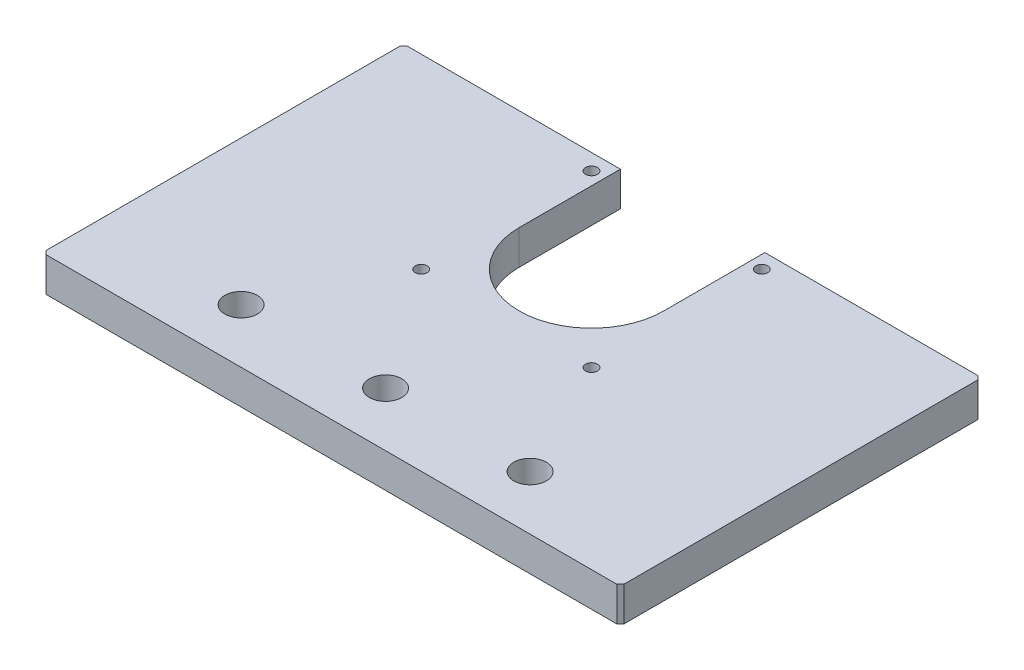
ISO-10303-21;
HEADER;
FILE_DESCRIPTION(('STEP AP214'),'2;1');
FILE_NAME('part.step','',(''),(''),'','','');
FILE_SCHEMA(('AUTOMOTIVE_DESIGN { 1 0 10303 214 1 1 1 1 }'));
ENDSEC;
DATA;
#1=APPLICATION_CONTEXT('core data for automotive mechanical design processes');
#2=APPLICATION_PROTOCOL_DEFINITION('international standard','automotive_design',2000,#1);
#3=PRODUCT_CONTEXT('',#1,'mechanical');
#4=PRODUCT('Part','Part','',(#3));
#5=PRODUCT_RELATED_PRODUCT_CATEGORY('part','',(#4));
#6=PRODUCT_DEFINITION_FORMATION('','',#4);
#7=PRODUCT_DEFINITION_CONTEXT('part definition',#1,'design');
#8=PRODUCT_DEFINITION('design','',#6,#7);
#9=PRODUCT_DEFINITION_SHAPE('','',#8);
#10=(LENGTH_UNIT() NAMED_UNIT(*) SI_UNIT(.MILLI.,.METRE.));
#11=(NAMED_UNIT(*) PLANE_ANGLE_UNIT() SI_UNIT($,.RADIAN.));
#12=(NAMED_UNIT(*) SI_UNIT($,.STERADIAN.) SOLID_ANGLE_UNIT());
#13=UNCERTAINTY_MEASURE_WITH_UNIT(LENGTH_MEASURE(1.E-05),#10,'distance_accuracy_value','');
#14=(GEOMETRIC_REPRESENTATION_CONTEXT(3) GLOBAL_UNCERTAINTY_ASSIGNED_CONTEXT((#13)) GLOBAL_UNIT_ASSIGNED_CONTEXT((#10,
#11,#12)) REPRESENTATION_CONTEXT('',''));
#15=CARTESIAN_POINT('',(0.,0.,0.));
#16=DIRECTION('',(0.,0.,1.));
#17=DIRECTION('',(1.,0.,0.));
#18=AXIS2_PLACEMENT_3D('',#15,#16,#17);
#19=CARTESIAN_POINT('',(0.,4.7625,0.));
#20=DIRECTION('',(0.,-1.,0.));
#21=DIRECTION('',(0.,0.,-1.));
#22=AXIS2_PLACEMENT_3D('',#19,#20,#21);
#23=CYLINDRICAL_SURFACE('',#22,20.);
#24=CARTESIAN_POINT('',(0.,-4.7625,0.));
#25=DIRECTION('',(0.,-1.,0.));
#26=DIRECTION('',(0.,0.,1.));
#27=AXIS2_PLACEMENT_3D('',#24,#25,#26);
#28=CIRCLE('',#27,20.);
#29=CARTESIAN_POINT('',(20.,-4.7625,0.));
#30=VERTEX_POINT('',#29);
#31=CARTESIAN_POINT('',(-20.,-4.7625,0.));
#32=VERTEX_POINT('',#31);
#33=EDGE_CURVE('E162',#30,#32,#28,.T.);
#34=ORIENTED_EDGE('',*,*,#33,.T.);
#35=DIRECTION('',(0.,-1.,0.));
#36=VECTOR('',#35,1.);
#37=CARTESIAN_POINT('',(-20.,4.7625,0.));
#38=LINE('',#37,#36);
#39=CARTESIAN_POINT('',(-20.,4.7625,0.));
#40=VERTEX_POINT('',#39);
#41=EDGE_CURVE('E141',#40,#32,#38,.T.);
#42=ORIENTED_EDGE('',*,*,#41,.F.);
#43=CARTESIAN_POINT('',(0.,4.7625,0.));
#44=DIRECTION('',(0.,-1.,0.));
#45=DIRECTION('',(0.,0.,1.));
#46=AXIS2_PLACEMENT_3D('',#43,#44,#45);
#47=CIRCLE('',#46,20.);
#48=CARTESIAN_POINT('',(20.,4.7625,0.));
#49=VERTEX_POINT('',#48);
#50=EDGE_CURVE('E149',#49,#40,#47,.T.);
#51=ORIENTED_EDGE('',*,*,#50,.F.);
#52=DIRECTION('',(0.,-1.,0.));
#53=VECTOR('',#52,1.);
#54=CARTESIAN_POINT('',(20.,4.7625,0.));
#55=LINE('',#54,#53);
#56=EDGE_CURVE('E239',#49,#30,#55,.T.);
#57=ORIENTED_EDGE('',*,*,#56,.T.);
#58=EDGE_LOOP('',(#34,#42,#51,#57));
#59=FACE_BOUND('',#58,.T.);
#60=ADVANCED_FACE('F44',(#59),#23,.F.);
#61=CARTESIAN_POINT('',(-20.,4.7625,-28.));
#62=DIRECTION('',(-1.,0.,0.));
#63=DIRECTION('',(0.,0.,1.));
#64=AXIS2_PLACEMENT_3D('',#61,#62,#63);
#65=PLANE('',#64);
#66=DIRECTION('',(0.,0.,-1.));
#67=VECTOR('',#66,1.);
#68=CARTESIAN_POINT('',(-20.,-4.7625,-28.));
#69=LINE('',#68,#67);
#70=CARTESIAN_POINT('',(-20.,-4.7625,-28.));
#71=VERTEX_POINT('',#70);
#72=EDGE_CURVE('E249',#32,#71,#69,.T.);
#73=ORIENTED_EDGE('',*,*,#72,.T.);
#74=DIRECTION('',(0.,-1.,0.));
#75=VECTOR('',#74,1.);
#76=CARTESIAN_POINT('',(-20.,4.7625,-28.));
#77=LINE('',#76,#75);
#78=CARTESIAN_POINT('',(-20.,4.7625,-28.));
#79=VERTEX_POINT('',#78);
#80=EDGE_CURVE('E144',#79,#71,#77,.T.);
#81=ORIENTED_EDGE('',*,*,#80,.F.);
#82=DIRECTION('',(0.,0.,-1.));
#83=VECTOR('',#82,1.);
#84=CARTESIAN_POINT('',(-20.,4.7625,-28.));
#85=LINE('',#84,#83);
#86=EDGE_CURVE('E137',#40,#79,#85,.T.);
#87=ORIENTED_EDGE('',*,*,#86,.F.);
#88=ORIENTED_EDGE('',*,*,#41,.T.);
#89=EDGE_LOOP('',(#73,#81,#87,#88));
#90=FACE_BOUND('',#89,.T.);
#91=ADVANCED_FACE('F139',(#90),#65,.F.);
#92=CARTESIAN_POINT('',(-80.,4.7625,-28.));
#93=DIRECTION('',(0.,0.,1.));
#94=DIRECTION('',(1.,0.,0.));
#95=AXIS2_PLACEMENT_3D('',#92,#93,#94);
#96=PLANE('',#95);
#97=DIRECTION('',(-1.,0.,0.));
#98=VECTOR('',#97,1.);
#99=CARTESIAN_POINT('',(-80.,-4.7625,-28.));
#100=LINE('',#99,#98);
#101=CARTESIAN_POINT('',(-79.,-4.7625,-28.));
#102=VERTEX_POINT('',#101);
#103=EDGE_CURVE('E255',#71,#102,#100,.T.);
#104=ORIENTED_EDGE('',*,*,#103,.T.);
#105=DIRECTION('',(0.,1.,0.));
#106=VECTOR('',#105,1.);
#107=CARTESIAN_POINT('',(-79.,4.7625,-28.));
#108=LINE('',#107,#106);
#109=CARTESIAN_POINT('',(-79.,4.7625,-28.));
#110=VERTEX_POINT('',#109);
#111=EDGE_CURVE('E189',#102,#110,#108,.T.);
#112=ORIENTED_EDGE('',*,*,#111,.T.);
#113=DIRECTION('',(-1.,0.,0.));
#114=VECTOR('',#113,1.);
#115=CARTESIAN_POINT('',(-80.,4.7625,-28.));
#116=LINE('',#115,#114);
#117=EDGE_CURVE('E148',#79,#110,#116,.T.);
#118=ORIENTED_EDGE('',*,*,#117,.F.);
#119=ORIENTED_EDGE('',*,*,#80,.T.);
#120=EDGE_LOOP('',(#104,#112,#118,#119));
#121=FACE_BOUND('',#120,.T.);
#122=ADVANCED_FACE('F307',(#121),#96,.F.);
#123=CARTESIAN_POINT('',(-80.,4.7625,72.));
#124=DIRECTION('',(1.,0.,0.));
#125=DIRECTION('',(0.,0.,-1.));
#126=AXIS2_PLACEMENT_3D('',#123,#124,#125);
#127=PLANE('',#126);
#128=DIRECTION('',(0.,0.,1.));
#129=VECTOR('',#128,1.);
#130=CARTESIAN_POINT('',(-80.,4.7625,72.));
#131=LINE('',#130,#129);
#132=CARTESIAN_POINT('',(-80.,4.7625,-27.));
#133=VERTEX_POINT('',#132);
#134=CARTESIAN_POINT('',(-80.,4.7625,71.));
#135=VERTEX_POINT('',#134);
#136=EDGE_CURVE('E280',#133,#135,#131,.T.);
#137=ORIENTED_EDGE('',*,*,#136,.F.);
#138=DIRECTION('',(0.,-1.,0.));
#139=VECTOR('',#138,1.);
#140=CARTESIAN_POINT('',(-80.,4.7625,-27.));
#141=LINE('',#140,#139);
#142=CARTESIAN_POINT('',(-80.,-4.7625,-27.));
#143=VERTEX_POINT('',#142);
#144=EDGE_CURVE('E168',#133,#143,#141,.T.);
#145=ORIENTED_EDGE('',*,*,#144,.T.);
#146=DIRECTION('',(0.,0.,1.));
#147=VECTOR('',#146,1.);
#148=CARTESIAN_POINT('',(-80.,-4.7625,72.));
#149=LINE('',#148,#147);
#150=CARTESIAN_POINT('',(-80.,-4.7625,71.));
#151=VERTEX_POINT('',#150);
#152=EDGE_CURVE('E233',#143,#151,#149,.T.);
#153=ORIENTED_EDGE('',*,*,#152,.T.);
#154=DIRECTION('',(0.,1.,0.));
#155=VECTOR('',#154,1.);
#156=CARTESIAN_POINT('',(-80.,4.7625,71.));
#157=LINE('',#156,#155);
#158=EDGE_CURVE('E164',#151,#135,#157,.T.);
#159=ORIENTED_EDGE('',*,*,#158,.T.);
#160=EDGE_LOOP('',(#137,#145,#153,#159));
#161=FACE_BOUND('',#160,.T.);
#162=ADVANCED_FACE('F270',(#161),#127,.F.);
#163=CARTESIAN_POINT('',(80.,4.7625,72.));
#164=DIRECTION('',(0.,0.,-1.));
#165=DIRECTION('',(-1.,0.,0.));
#166=AXIS2_PLACEMENT_3D('',#163,#164,#165);
#167=PLANE('',#166);
#168=DIRECTION('',(1.,0.,0.));
#169=VECTOR('',#168,1.);
#170=CARTESIAN_POINT('',(80.,4.7625,72.));
#171=LINE('',#170,#169);
#172=CARTESIAN_POINT('',(-79.,4.7625,72.));
#173=VERTEX_POINT('',#172);
#174=CARTESIAN_POINT('',(79.,4.7625,72.));
#175=VERTEX_POINT('',#174);
#176=EDGE_CURVE('E279',#173,#175,#171,.T.);
#177=ORIENTED_EDGE('',*,*,#176,.F.);
#178=DIRECTION('',(0.,-1.,0.));
#179=VECTOR('',#178,1.);
#180=CARTESIAN_POINT('',(-79.,4.7625,72.));
#181=LINE('',#180,#179);
#182=CARTESIAN_POINT('',(-79.,-4.7625,72.));
#183=VERTEX_POINT('',#182);
#184=EDGE_CURVE('E206',#173,#183,#181,.T.);
#185=ORIENTED_EDGE('',*,*,#184,.T.);
#186=DIRECTION('',(1.,0.,0.));
#187=VECTOR('',#186,1.);
#188=CARTESIAN_POINT('',(80.,-4.7625,72.));
#189=LINE('',#188,#187);
#190=CARTESIAN_POINT('',(79.,-4.7625,72.));
#191=VERTEX_POINT('',#190);
#192=EDGE_CURVE('E228',#183,#191,#189,.T.);
#193=ORIENTED_EDGE('',*,*,#192,.T.);
#194=DIRECTION('',(0.,1.,0.));
#195=VECTOR('',#194,1.);
#196=CARTESIAN_POINT('',(79.,4.7625,72.));
#197=LINE('',#196,#195);
#198=EDGE_CURVE('E203',#191,#175,#197,.T.);
#199=ORIENTED_EDGE('',*,*,#198,.T.);
#200=EDGE_LOOP('',(#177,#185,#193,#199));
#201=FACE_BOUND('',#200,.T.);
#202=ADVANCED_FACE('F282',(#201),#167,.F.);
#203=CARTESIAN_POINT('',(80.,4.7625,-28.));
#204=DIRECTION('',(-1.,0.,0.));
#205=DIRECTION('',(0.,0.,1.));
#206=AXIS2_PLACEMENT_3D('',#203,#204,#205);
#207=PLANE('',#206);
#208=DIRECTION('',(0.,0.,-1.));
#209=VECTOR('',#208,1.);
#210=CARTESIAN_POINT('',(80.,4.7625,-28.));
#211=LINE('',#210,#209);
#212=CARTESIAN_POINT('',(80.,4.7625,71.));
#213=VERTEX_POINT('',#212);
#214=CARTESIAN_POINT('',(80.,4.7625,-27.));
#215=VERTEX_POINT('',#214);
#216=EDGE_CURVE('E217',#213,#215,#211,.T.);
#217=ORIENTED_EDGE('',*,*,#216,.F.);
#218=DIRECTION('',(0.,-1.,0.));
#219=VECTOR('',#218,1.);
#220=CARTESIAN_POINT('',(80.,4.7625,71.));
#221=LINE('',#220,#219);
#222=CARTESIAN_POINT('',(80.,-4.7625,71.));
#223=VERTEX_POINT('',#222);
#224=EDGE_CURVE('E54',#213,#223,#221,.T.);
#225=ORIENTED_EDGE('',*,*,#224,.T.);
#226=DIRECTION('',(0.,0.,-1.));
#227=VECTOR('',#226,1.);
#228=CARTESIAN_POINT('',(80.,-4.7625,-28.));
#229=LINE('',#228,#227);
#230=CARTESIAN_POINT('',(80.,-4.7625,-27.));
#231=VERTEX_POINT('',#230);
#232=EDGE_CURVE('E216',#223,#231,#229,.T.);
#233=ORIENTED_EDGE('',*,*,#232,.T.);
#234=DIRECTION('',(0.,1.,0.));
#235=VECTOR('',#234,1.);
#236=CARTESIAN_POINT('',(80.,4.7625,-27.));
#237=LINE('',#236,#235);
#238=EDGE_CURVE('E69',#231,#215,#237,.T.);
#239=ORIENTED_EDGE('',*,*,#238,.T.);
#240=EDGE_LOOP('',(#217,#225,#233,#239));
#241=FACE_BOUND('',#240,.T.);
#242=ADVANCED_FACE('F215',(#241),#207,.F.);
#243=CARTESIAN_POINT('',(20.,4.7625,-28.));
#244=DIRECTION('',(0.,0.,1.));
#245=DIRECTION('',(1.,0.,0.));
#246=AXIS2_PLACEMENT_3D('',#243,#244,#245);
#247=PLANE('',#246);
#248=DIRECTION('',(-1.,0.,0.));
#249=VECTOR('',#248,1.);
#250=CARTESIAN_POINT('',(20.,4.7625,-28.));
#251=LINE('',#250,#249);
#252=CARTESIAN_POINT('',(79.,4.7625,-28.));
#253=VERTEX_POINT('',#252);
#254=CARTESIAN_POINT('',(20.,4.7625,-28.));
#255=VERTEX_POINT('',#254);
#256=EDGE_CURVE('E288',#253,#255,#251,.T.);
#257=ORIENTED_EDGE('',*,*,#256,.F.);
#258=DIRECTION('',(0.,-1.,0.));
#259=VECTOR('',#258,1.);
#260=CARTESIAN_POINT('',(79.,4.7625,-28.));
#261=LINE('',#260,#259);
#262=CARTESIAN_POINT('',(79.,-4.7625,-28.));
#263=VERTEX_POINT('',#262);
#264=EDGE_CURVE('E11',#253,#263,#261,.T.);
#265=ORIENTED_EDGE('',*,*,#264,.T.);
#266=DIRECTION('',(-1.,0.,0.));
#267=VECTOR('',#266,1.);
#268=CARTESIAN_POINT('',(20.,-4.7625,-28.));
#269=LINE('',#268,#267);
#270=CARTESIAN_POINT('',(20.,-4.7625,-28.));
#271=VERTEX_POINT('',#270);
#272=EDGE_CURVE('E227',#263,#271,#269,.T.);
#273=ORIENTED_EDGE('',*,*,#272,.T.);
#274=DIRECTION('',(0.,-1.,0.));
#275=VECTOR('',#274,1.);
#276=CARTESIAN_POINT('',(20.,4.7625,-28.));
#277=LINE('',#276,#275);
#278=EDGE_CURVE('E170',#255,#271,#277,.T.);
#279=ORIENTED_EDGE('',*,*,#278,.F.);
#280=EDGE_LOOP('',(#257,#265,#273,#279));
#281=FACE_BOUND('',#280,.T.);
#282=ADVANCED_FACE('F295',(#281),#247,.F.);
#283=CARTESIAN_POINT('',(20.,4.7625,0.));
#284=DIRECTION('',(1.,0.,0.));
#285=DIRECTION('',(0.,0.,-1.));
#286=AXIS2_PLACEMENT_3D('',#283,#284,#285);
#287=PLANE('',#286);
#288=DIRECTION('',(0.,0.,1.));
#289=VECTOR('',#288,1.);
#290=CARTESIAN_POINT('',(20.,-4.7625,0.));
#291=LINE('',#290,#289);
#292=EDGE_CURVE('E159',#271,#30,#291,.T.);
#293=ORIENTED_EDGE('',*,*,#292,.T.);
#294=ORIENTED_EDGE('',*,*,#56,.F.);
#295=DIRECTION('',(0.,0.,1.));
#296=VECTOR('',#295,1.);
#297=CARTESIAN_POINT('',(20.,4.7625,0.));
#298=LINE('',#297,#296);
#299=EDGE_CURVE('E154',#255,#49,#298,.T.);
#300=ORIENTED_EDGE('',*,*,#299,.F.);
#301=ORIENTED_EDGE('',*,*,#278,.T.);
#302=EDGE_LOOP('',(#293,#294,#300,#301));
#303=FACE_BOUND('',#302,.T.);
#304=ADVANCED_FACE('F246',(#303),#287,.F.);
#305=CARTESIAN_POINT('',(0.,4.7625,0.));
#306=DIRECTION('',(0.,1.,0.));
#307=DIRECTION('',(0.,0.,1.));
#308=AXIS2_PLACEMENT_3D('',#305,#306,#307);
#309=PLANE('',#308);
#310=CARTESIAN_POINT('',(-23.5731723178065,4.7625,23.5731723178065));
#311=DIRECTION('',(0.,1.,0.));
#312=DIRECTION('',(0.,0.,1.));
#313=AXIS2_PLACEMENT_3D('',#310,#311,#312);
#314=CIRCLE('',#313,1.65);
#315=CARTESIAN_POINT('',(-23.5731723178065,4.7625,25.2231723178065));
#316=VERTEX_POINT('',#315);
#317=EDGE_CURVE('E577',#316,#316,#314,.T.);
#318=ORIENTED_EDGE('',*,*,#317,.F.);
#319=EDGE_LOOP('',(#318));
#320=FACE_BOUND('',#319,.T.);
#321=CARTESIAN_POINT('',(-23.5731723178065,4.7625,-23.5731723178065));
#322=DIRECTION('',(0.,1.,0.));
#323=DIRECTION('',(0.,0.,1.));
#324=AXIS2_PLACEMENT_3D('',#321,#322,#323);
#325=CIRCLE('',#324,1.65);
#326=CARTESIAN_POINT('',(-23.5731723178065,4.7625,-21.9231723178065));
#327=VERTEX_POINT('',#326);
#328=EDGE_CURVE('E569',#327,#327,#325,.T.);
#329=ORIENTED_EDGE('',*,*,#328,.F.);
#330=EDGE_LOOP('',(#329));
#331=FACE_BOUND('',#330,.T.);
#332=CARTESIAN_POINT('',(23.5731723178065,4.7625,-23.5731723178065));
#333=DIRECTION('',(0.,1.,0.));
#334=DIRECTION('',(0.,0.,1.));
#335=AXIS2_PLACEMENT_3D('',#332,#333,#334);
#336=CIRCLE('',#335,1.65);
#337=CARTESIAN_POINT('',(23.5731723178065,4.7625,-21.9231723178065));
#338=VERTEX_POINT('',#337);
#339=EDGE_CURVE('E561',#338,#338,#336,.T.);
#340=ORIENTED_EDGE('',*,*,#339,.F.);
#341=EDGE_LOOP('',(#340));
#342=FACE_BOUND('',#341,.T.);
#343=CARTESIAN_POINT('',(23.5731723178065,4.7625,23.5731723178065));
#344=DIRECTION('',(0.,1.,0.));
#345=DIRECTION('',(0.,0.,1.));
#346=AXIS2_PLACEMENT_3D('',#343,#344,#345);
#347=CIRCLE('',#346,1.65);
#348=CARTESIAN_POINT('',(23.5731723178065,4.7625,25.2231723178065));
#349=VERTEX_POINT('',#348);
#350=EDGE_CURVE('E553',#349,#349,#347,.T.);
#351=ORIENTED_EDGE('',*,*,#350,.F.);
#352=EDGE_LOOP('',(#351));
#353=FACE_BOUND('',#352,.T.);
#354=CARTESIAN_POINT('',(-40.,4.7625,57.));
#355=DIRECTION('',(0.,1.,0.));
#356=DIRECTION('',(0.,0.,1.));
#357=AXIS2_PLACEMENT_3D('',#354,#355,#356);
#358=CIRCLE('',#357,4.49999999999999);
#359=CARTESIAN_POINT('',(-40.,4.7625,61.5));
#360=VERTEX_POINT('',#359);
#361=EDGE_CURVE('E545',#360,#360,#358,.T.);
#362=ORIENTED_EDGE('',*,*,#361,.F.);
#363=EDGE_LOOP('',(#362));
#364=FACE_BOUND('',#363,.T.);
#365=CARTESIAN_POINT('',(0.,4.7625,57.));
#366=DIRECTION('',(0.,1.,0.));
#367=DIRECTION('',(0.,0.,1.));
#368=AXIS2_PLACEMENT_3D('',#365,#366,#367);
#369=CIRCLE('',#368,4.49999999999999);
#370=CARTESIAN_POINT('',(0.,4.7625,61.5));
#371=VERTEX_POINT('',#370);
#372=EDGE_CURVE('E537',#371,#371,#369,.T.);
#373=ORIENTED_EDGE('',*,*,#372,.F.);
#374=EDGE_LOOP('',(#373));
#375=FACE_BOUND('',#374,.T.);
#376=CARTESIAN_POINT('',(40.,4.7625,57.));
#377=DIRECTION('',(0.,1.,0.));
#378=DIRECTION('',(0.,0.,1.));
#379=AXIS2_PLACEMENT_3D('',#376,#377,#378);
#380=CIRCLE('',#379,4.49999999999999);
#381=CARTESIAN_POINT('',(40.,4.7625,61.5));
#382=VERTEX_POINT('',#381);
#383=EDGE_CURVE('E258',#382,#382,#380,.T.);
#384=ORIENTED_EDGE('',*,*,#383,.F.);
#385=EDGE_LOOP('',(#384));
#386=FACE_BOUND('',#385,.T.);
#387=ORIENTED_EDGE('',*,*,#117,.T.);
#388=DIRECTION('',(0.707106781186555,0.,-0.70710678118654));
#389=VECTOR('',#388,1.);
#390=CARTESIAN_POINT('',(-53.4999999999992,4.7625,-53.5000000000003));
#391=LINE('',#390,#389);
#392=EDGE_CURVE('E200',#110,#133,#391,.F.);
#393=ORIENTED_EDGE('',*,*,#392,.T.);
#394=ORIENTED_EDGE('',*,*,#136,.T.);
#395=DIRECTION('',(-0.707106781186557,0.,-0.707106781186538));
#396=VECTOR('',#395,1.);
#397=CARTESIAN_POINT('',(-75.4999999999989,4.7625,75.500000000001));
#398=LINE('',#397,#396);
#399=EDGE_CURVE('E197',#135,#173,#398,.F.);
#400=ORIENTED_EDGE('',*,*,#399,.T.);
#401=ORIENTED_EDGE('',*,*,#176,.T.);
#402=DIRECTION('',(-0.707106781186548,0.,0.707106781186548));
#403=VECTOR('',#402,1.);
#404=CARTESIAN_POINT('',(75.5,4.7625,75.5));
#405=LINE('',#404,#403);
#406=EDGE_CURVE('E194',#175,#213,#405,.F.);
#407=ORIENTED_EDGE('',*,*,#406,.T.);
#408=ORIENTED_EDGE('',*,*,#216,.T.);
#409=DIRECTION('',(0.707106781186548,0.,0.707106781186548));
#410=VECTOR('',#409,1.);
#411=CARTESIAN_POINT('',(53.5,4.7625,-53.5));
#412=LINE('',#411,#410);
#413=EDGE_CURVE('E61',#215,#253,#412,.F.);
#414=ORIENTED_EDGE('',*,*,#413,.T.);
#415=ORIENTED_EDGE('',*,*,#256,.T.);
#416=ORIENTED_EDGE('',*,*,#299,.T.);
#417=ORIENTED_EDGE('',*,*,#50,.T.);
#418=ORIENTED_EDGE('',*,*,#86,.T.);
#419=EDGE_LOOP('',(#387,#393,#394,#400,#401,#407,#408,#414,#415,#416,#417,#418));
#420=FACE_BOUND('',#419,.T.);
#421=ADVANCED_FACE('F152',(#320,#331,#342,#353,#364,#375,#386,#420),#309,.T.);
#422=CARTESIAN_POINT('',(0.,-4.7625,0.));
#423=DIRECTION('',(0.,1.,0.));
#424=DIRECTION('',(0.,0.,1.));
#425=AXIS2_PLACEMENT_3D('',#422,#423,#424);
#426=PLANE('',#425);
#427=CARTESIAN_POINT('',(-23.5731723178065,-4.7625,23.5731723178065));
#428=DIRECTION('',(0.,1.,0.));
#429=DIRECTION('',(0.,0.,1.));
#430=AXIS2_PLACEMENT_3D('',#427,#428,#429);
#431=CIRCLE('',#430,1.65);
#432=CARTESIAN_POINT('',(-23.5731723178065,-4.7625,25.2231723178065));
#433=VERTEX_POINT('',#432);
#434=EDGE_CURVE('E573',#433,#433,#431,.T.);
#435=ORIENTED_EDGE('',*,*,#434,.T.);
#436=EDGE_LOOP('',(#435));
#437=FACE_BOUND('',#436,.T.);
#438=CARTESIAN_POINT('',(-23.5731723178065,-4.7625,-23.5731723178065));
#439=DIRECTION('',(0.,1.,0.));
#440=DIRECTION('',(0.,0.,1.));
#441=AXIS2_PLACEMENT_3D('',#438,#439,#440);
#442=CIRCLE('',#441,1.65);
#443=CARTESIAN_POINT('',(-23.5731723178065,-4.7625,-21.9231723178065));
#444=VERTEX_POINT('',#443);
#445=EDGE_CURVE('E565',#444,#444,#442,.T.);
#446=ORIENTED_EDGE('',*,*,#445,.T.);
#447=EDGE_LOOP('',(#446));
#448=FACE_BOUND('',#447,.T.);
#449=CARTESIAN_POINT('',(23.5731723178065,-4.7625,-23.5731723178065));
#450=DIRECTION('',(0.,1.,0.));
#451=DIRECTION('',(0.,0.,1.));
#452=AXIS2_PLACEMENT_3D('',#449,#450,#451);
#453=CIRCLE('',#452,1.65);
#454=CARTESIAN_POINT('',(23.5731723178065,-4.7625,-21.9231723178065));
#455=VERTEX_POINT('',#454);
#456=EDGE_CURVE('E557',#455,#455,#453,.T.);
#457=ORIENTED_EDGE('',*,*,#456,.T.);
#458=EDGE_LOOP('',(#457));
#459=FACE_BOUND('',#458,.T.);
#460=CARTESIAN_POINT('',(23.5731723178065,-4.7625,23.5731723178065));
#461=DIRECTION('',(0.,1.,0.));
#462=DIRECTION('',(0.,0.,1.));
#463=AXIS2_PLACEMENT_3D('',#460,#461,#462);
#464=CIRCLE('',#463,1.65);
#465=CARTESIAN_POINT('',(23.5731723178065,-4.7625,25.2231723178065));
#466=VERTEX_POINT('',#465);
#467=EDGE_CURVE('E549',#466,#466,#464,.T.);
#468=ORIENTED_EDGE('',*,*,#467,.T.);
#469=EDGE_LOOP('',(#468));
#470=FACE_BOUND('',#469,.T.);
#471=CARTESIAN_POINT('',(-40.,-4.7625,57.));
#472=DIRECTION('',(0.,1.,0.));
#473=DIRECTION('',(0.,0.,1.));
#474=AXIS2_PLACEMENT_3D('',#471,#472,#473);
#475=CIRCLE('',#474,4.5);
#476=CARTESIAN_POINT('',(-40.,-4.7625,61.5));
#477=VERTEX_POINT('',#476);
#478=EDGE_CURVE('E541',#477,#477,#475,.T.);
#479=ORIENTED_EDGE('',*,*,#478,.T.);
#480=EDGE_LOOP('',(#479));
#481=FACE_BOUND('',#480,.T.);
#482=CARTESIAN_POINT('',(0.,-4.7625,57.));
#483=DIRECTION('',(0.,1.,0.));
#484=DIRECTION('',(0.,0.,1.));
#485=AXIS2_PLACEMENT_3D('',#482,#483,#484);
#486=CIRCLE('',#485,4.5);
#487=CARTESIAN_POINT('',(0.,-4.7625,61.5));
#488=VERTEX_POINT('',#487);
#489=EDGE_CURVE('E533',#488,#488,#486,.T.);
#490=ORIENTED_EDGE('',*,*,#489,.T.);
#491=EDGE_LOOP('',(#490));
#492=FACE_BOUND('',#491,.T.);
#493=CARTESIAN_POINT('',(40.,-4.7625,57.));
#494=DIRECTION('',(0.,1.,0.));
#495=DIRECTION('',(0.,0.,1.));
#496=AXIS2_PLACEMENT_3D('',#493,#494,#495);
#497=CIRCLE('',#496,4.5);
#498=CARTESIAN_POINT('',(40.,-4.7625,61.5));
#499=VERTEX_POINT('',#498);
#500=EDGE_CURVE('E251',#499,#499,#497,.T.);
#501=ORIENTED_EDGE('',*,*,#500,.T.);
#502=EDGE_LOOP('',(#501));
#503=FACE_BOUND('',#502,.T.);
#504=ORIENTED_EDGE('',*,*,#152,.F.);
#505=DIRECTION('',(-0.707106781186555,0.,0.70710678118654));
#506=VECTOR('',#505,1.);
#507=CARTESIAN_POINT('',(-80.,-4.7625,-27.));
#508=LINE('',#507,#506);
#509=EDGE_CURVE('E186',#143,#102,#508,.F.);
#510=ORIENTED_EDGE('',*,*,#509,.T.);
#511=ORIENTED_EDGE('',*,*,#103,.F.);
#512=ORIENTED_EDGE('',*,*,#72,.F.);
#513=ORIENTED_EDGE('',*,*,#33,.F.);
#514=ORIENTED_EDGE('',*,*,#292,.F.);
#515=ORIENTED_EDGE('',*,*,#272,.F.);
#516=DIRECTION('',(-0.707106781186548,0.,-0.707106781186548));
#517=VECTOR('',#516,1.);
#518=CARTESIAN_POINT('',(79.,-4.7625,-28.));
#519=LINE('',#518,#517);
#520=EDGE_CURVE('E177',#263,#231,#519,.F.);
#521=ORIENTED_EDGE('',*,*,#520,.T.);
#522=ORIENTED_EDGE('',*,*,#232,.F.);
#523=DIRECTION('',(0.707106781186548,0.,-0.707106781186548));
#524=VECTOR('',#523,1.);
#525=CARTESIAN_POINT('',(80.,-4.7625,71.));
#526=LINE('',#525,#524);
#527=EDGE_CURVE('E180',#223,#191,#526,.F.);
#528=ORIENTED_EDGE('',*,*,#527,.T.);
#529=ORIENTED_EDGE('',*,*,#192,.F.);
#530=DIRECTION('',(0.707106781186557,0.,0.707106781186538));
#531=VECTOR('',#530,1.);
#532=CARTESIAN_POINT('',(-79.,-4.7625,72.));
#533=LINE('',#532,#531);
#534=EDGE_CURVE('E183',#183,#151,#533,.F.);
#535=ORIENTED_EDGE('',*,*,#534,.T.);
#536=EDGE_LOOP('',(#504,#510,#511,#512,#513,#514,#515,#521,#522,#528,#529,#535));
#537=FACE_BOUND('',#536,.T.);
#538=ADVANCED_FACE('F222',(#437,#448,#459,#470,#481,#492,#503,#537),#426,.F.);
#539=CARTESIAN_POINT('',(40.,4.7625,57.));
#540=DIRECTION('',(0.,1.,0.));
#541=DIRECTION('',(0.,0.,1.));
#542=AXIS2_PLACEMENT_3D('',#539,#540,#541);
#543=CYLINDRICAL_SURFACE('',#542,4.49999999999999);
#544=ORIENTED_EDGE('',*,*,#500,.F.);
#545=EDGE_LOOP('',(#544));
#546=FACE_BOUND('',#545,.T.);
#547=ORIENTED_EDGE('',*,*,#383,.T.);
#548=EDGE_LOOP('',(#547));
#549=FACE_BOUND('',#548,.T.);
#550=ADVANCED_FACE('F407',(#546,#549),#543,.F.);
#551=CARTESIAN_POINT('',(0.,4.7625,57.));
#552=DIRECTION('',(0.,1.,0.));
#553=DIRECTION('',(0.,0.,1.));
#554=AXIS2_PLACEMENT_3D('',#551,#552,#553);
#555=CYLINDRICAL_SURFACE('',#554,4.49999999999999);
#556=ORIENTED_EDGE('',*,*,#489,.F.);
#557=EDGE_LOOP('',(#556));
#558=FACE_BOUND('',#557,.T.);
#559=ORIENTED_EDGE('',*,*,#372,.T.);
#560=EDGE_LOOP('',(#559));
#561=FACE_BOUND('',#560,.T.);
#562=ADVANCED_FACE('F398',(#558,#561),#555,.F.);
#563=CARTESIAN_POINT('',(-40.,4.7625,57.));
#564=DIRECTION('',(0.,1.,0.));
#565=DIRECTION('',(0.,0.,1.));
#566=AXIS2_PLACEMENT_3D('',#563,#564,#565);
#567=CYLINDRICAL_SURFACE('',#566,4.49999999999999);
#568=ORIENTED_EDGE('',*,*,#478,.F.);
#569=EDGE_LOOP('',(#568));
#570=FACE_BOUND('',#569,.T.);
#571=ORIENTED_EDGE('',*,*,#361,.T.);
#572=EDGE_LOOP('',(#571));
#573=FACE_BOUND('',#572,.T.);
#574=ADVANCED_FACE('F388',(#570,#573),#567,.F.);
#575=CARTESIAN_POINT('',(23.5731723178065,4.7625,23.5731723178065));
#576=DIRECTION('',(0.,1.,0.));
#577=DIRECTION('',(0.,0.,1.));
#578=AXIS2_PLACEMENT_3D('',#575,#576,#577);
#579=CYLINDRICAL_SURFACE('',#578,1.65);
#580=ORIENTED_EDGE('',*,*,#467,.F.);
#581=EDGE_LOOP('',(#580));
#582=FACE_BOUND('',#581,.T.);
#583=ORIENTED_EDGE('',*,*,#350,.T.);
#584=EDGE_LOOP('',(#583));
#585=FACE_BOUND('',#584,.T.);
#586=ADVANCED_FACE('F378',(#582,#585),#579,.F.);
#587=CARTESIAN_POINT('',(23.5731723178065,4.7625,-23.5731723178065));
#588=DIRECTION('',(0.,1.,0.));
#589=DIRECTION('',(0.,0.,1.));
#590=AXIS2_PLACEMENT_3D('',#587,#588,#589);
#591=CYLINDRICAL_SURFACE('',#590,1.65);
#592=ORIENTED_EDGE('',*,*,#456,.F.);
#593=EDGE_LOOP('',(#592));
#594=FACE_BOUND('',#593,.T.);
#595=ORIENTED_EDGE('',*,*,#339,.T.);
#596=EDGE_LOOP('',(#595));
#597=FACE_BOUND('',#596,.T.);
#598=ADVANCED_FACE('F368',(#594,#597),#591,.F.);
#599=CARTESIAN_POINT('',(-23.5731723178065,4.7625,-23.5731723178065));
#600=DIRECTION('',(0.,1.,0.));
#601=DIRECTION('',(0.,0.,1.));
#602=AXIS2_PLACEMENT_3D('',#599,#600,#601);
#603=CYLINDRICAL_SURFACE('',#602,1.65);
#604=ORIENTED_EDGE('',*,*,#445,.F.);
#605=EDGE_LOOP('',(#604));
#606=FACE_BOUND('',#605,.T.);
#607=ORIENTED_EDGE('',*,*,#328,.T.);
#608=EDGE_LOOP('',(#607));
#609=FACE_BOUND('',#608,.T.);
#610=ADVANCED_FACE('F357',(#606,#609),#603,.F.);
#611=CARTESIAN_POINT('',(-23.5731723178065,4.7625,23.5731723178065));
#612=DIRECTION('',(0.,1.,0.));
#613=DIRECTION('',(0.,0.,1.));
#614=AXIS2_PLACEMENT_3D('',#611,#612,#613);
#615=CYLINDRICAL_SURFACE('',#614,1.65);
#616=ORIENTED_EDGE('',*,*,#434,.F.);
#617=EDGE_LOOP('',(#616));
#618=FACE_BOUND('',#617,.T.);
#619=ORIENTED_EDGE('',*,*,#317,.T.);
#620=EDGE_LOOP('',(#619));
#621=FACE_BOUND('',#620,.T.);
#622=ADVANCED_FACE('F318',(#618,#621),#615,.F.);
#623=CARTESIAN_POINT('',(-80.,4.7625,-27.));
#624=DIRECTION('',(0.70710678118654,0.,0.707106781186555));
#625=DIRECTION('',(0.,-1.,0.));
#626=AXIS2_PLACEMENT_3D('',#623,#624,#625);
#627=PLANE('',#626);
#628=ORIENTED_EDGE('',*,*,#392,.F.);
#629=ORIENTED_EDGE('',*,*,#111,.F.);
#630=ORIENTED_EDGE('',*,*,#509,.F.);
#631=ORIENTED_EDGE('',*,*,#144,.F.);
#632=EDGE_LOOP('',(#628,#629,#630,#631));
#633=FACE_BOUND('',#632,.T.);
#634=ADVANCED_FACE('F312',(#633),#627,.F.);
#635=CARTESIAN_POINT('',(-79.,4.7625,72.));
#636=DIRECTION('',(0.707106781186538,0.,-0.707106781186557));
#637=DIRECTION('',(0.,-1.,0.));
#638=AXIS2_PLACEMENT_3D('',#635,#636,#637);
#639=PLANE('',#638);
#640=ORIENTED_EDGE('',*,*,#399,.F.);
#641=ORIENTED_EDGE('',*,*,#158,.F.);
#642=ORIENTED_EDGE('',*,*,#534,.F.);
#643=ORIENTED_EDGE('',*,*,#184,.F.);
#644=EDGE_LOOP('',(#640,#641,#642,#643));
#645=FACE_BOUND('',#644,.T.);
#646=ADVANCED_FACE('F275',(#645),#639,.F.);
#647=CARTESIAN_POINT('',(80.,4.7625,71.));
#648=DIRECTION('',(-0.707106781186548,0.,-0.707106781186548));
#649=DIRECTION('',(0.,-1.,0.));
#650=AXIS2_PLACEMENT_3D('',#647,#648,#649);
#651=PLANE('',#650);
#652=ORIENTED_EDGE('',*,*,#406,.F.);
#653=ORIENTED_EDGE('',*,*,#198,.F.);
#654=ORIENTED_EDGE('',*,*,#527,.F.);
#655=ORIENTED_EDGE('',*,*,#224,.F.);
#656=EDGE_LOOP('',(#652,#653,#654,#655));
#657=FACE_BOUND('',#656,.T.);
#658=ADVANCED_FACE('F298',(#657),#651,.F.);
#659=CARTESIAN_POINT('',(79.,4.7625,-28.));
#660=DIRECTION('',(-0.707106781186547,0.,0.707106781186547));
#661=DIRECTION('',(0.,-1.,0.));
#662=AXIS2_PLACEMENT_3D('',#659,#660,#661);
#663=PLANE('',#662);
#664=ORIENTED_EDGE('',*,*,#413,.F.);
#665=ORIENTED_EDGE('',*,*,#238,.F.);
#666=ORIENTED_EDGE('',*,*,#520,.F.);
#667=ORIENTED_EDGE('',*,*,#264,.F.);
#668=EDGE_LOOP('',(#664,#665,#666,#667));
#669=FACE_BOUND('',#668,.T.);
#670=ADVANCED_FACE('F47',(#669),#663,.F.);
#671=CLOSED_SHELL('',(#60,#91,#122,#162,#202,#242,#282,#304,#421,#538,#550,#562,#574,#586,#598,
#610,#622,#634,#646,#658,#670));
#672=MANIFOLD_SOLID_BREP('B2',#671);
#673=ADVANCED_BREP_SHAPE_REPRESENTATION('',(#18,#672),#14);
#674=SHAPE_DEFINITION_REPRESENTATION(#9,#673);
ENDSEC;
END-ISO-10303-21;
